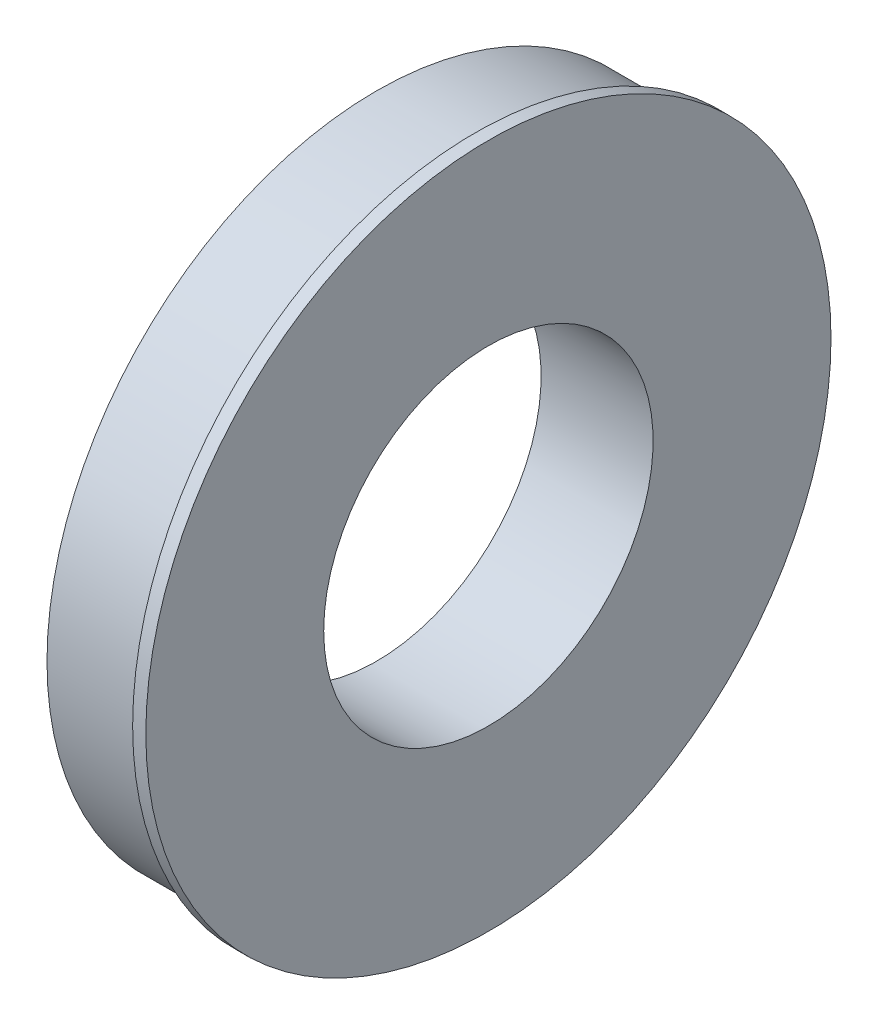
ISO-10303-21;
HEADER;
FILE_DESCRIPTION(('STEP AP214'),'2;1');
FILE_NAME('part.step','',(''),(''),'','','');
FILE_SCHEMA(('AUTOMOTIVE_DESIGN { 1 0 10303 214 1 1 1 1 }'));
ENDSEC;
DATA;
#1=APPLICATION_CONTEXT('core data for automotive mechanical design processes');
#2=APPLICATION_PROTOCOL_DEFINITION('international standard','automotive_design',2000,#1);
#3=PRODUCT_CONTEXT('',#1,'mechanical');
#4=PRODUCT('Part','Part','',(#3));
#5=PRODUCT_RELATED_PRODUCT_CATEGORY('part','',(#4));
#6=PRODUCT_DEFINITION_FORMATION('','',#4);
#7=PRODUCT_DEFINITION_CONTEXT('part definition',#1,'design');
#8=PRODUCT_DEFINITION('design','',#6,#7);
#9=PRODUCT_DEFINITION_SHAPE('','',#8);
#10=(LENGTH_UNIT() NAMED_UNIT(*) SI_UNIT(.MILLI.,.METRE.));
#11=(NAMED_UNIT(*) PLANE_ANGLE_UNIT() SI_UNIT($,.RADIAN.));
#12=(NAMED_UNIT(*) SI_UNIT($,.STERADIAN.) SOLID_ANGLE_UNIT());
#13=UNCERTAINTY_MEASURE_WITH_UNIT(LENGTH_MEASURE(1.E-05),#10,'distance_accuracy_value','');
#14=(GEOMETRIC_REPRESENTATION_CONTEXT(3) GLOBAL_UNCERTAINTY_ASSIGNED_CONTEXT((#13)) GLOBAL_UNIT_ASSIGNED_CONTEXT((#10,
#11,#12)) REPRESENTATION_CONTEXT('',''));
#15=CARTESIAN_POINT('',(0.,0.,0.));
#16=DIRECTION('',(0.,0.,1.));
#17=DIRECTION('',(1.,0.,0.));
#18=AXIS2_PLACEMENT_3D('',#15,#16,#17);
#19=CARTESIAN_POINT('',(0.,0.,0.));
#20=DIRECTION('',(1.,0.,0.));
#21=DIRECTION('',(0.,0.,-1.));
#22=AXIS2_PLACEMENT_3D('',#19,#20,#21);
#23=PLANE('',#22);
#24=CARTESIAN_POINT('',(0.,0.,0.));
#25=DIRECTION('',(1.,0.,0.));
#26=DIRECTION('',(0.,0.,-1.));
#27=AXIS2_PLACEMENT_3D('',#24,#25,#26);
#28=CIRCLE('',#27,63.5);
#29=CARTESIAN_POINT('',(0.,0.,63.5));
#30=VERTEX_POINT('',#29);
#31=EDGE_CURVE('E39',#30,#30,#28,.T.);
#32=ORIENTED_EDGE('',*,*,#31,.F.);
#33=EDGE_LOOP('',(#32));
#34=FACE_BOUND('',#33,.T.);
#35=CARTESIAN_POINT('',(0.,0.,0.));
#36=DIRECTION('',(1.,0.,0.));
#37=DIRECTION('',(0.,0.,-1.));
#38=AXIS2_PLACEMENT_3D('',#35,#36,#37);
#39=CIRCLE('',#38,31.75);
#40=CARTESIAN_POINT('',(0.,0.,31.75));
#41=VERTEX_POINT('',#40);
#42=EDGE_CURVE('E46',#41,#41,#39,.T.);
#43=ORIENTED_EDGE('',*,*,#42,.T.);
#44=EDGE_LOOP('',(#43));
#45=FACE_BOUND('',#44,.T.);
#46=ADVANCED_FACE('F35',(#34,#45),#23,.F.);
#47=CARTESIAN_POINT('',(19.05,0.,0.));
#48=DIRECTION('',(-1.,0.,0.));
#49=DIRECTION('',(0.,0.,1.));
#50=AXIS2_PLACEMENT_3D('',#47,#48,#49);
#51=CYLINDRICAL_SURFACE('',#50,63.5);
#52=CARTESIAN_POINT('',(19.05,0.,0.));
#53=DIRECTION('',(1.,0.,0.));
#54=DIRECTION('',(0.,0.,-1.));
#55=AXIS2_PLACEMENT_3D('',#52,#53,#54);
#56=CIRCLE('',#55,63.5);
#57=CARTESIAN_POINT('',(19.05,0.,63.5));
#58=VERTEX_POINT('',#57);
#59=EDGE_CURVE('E10',#58,#58,#56,.T.);
#60=CARTESIAN_POINT('',(19.05,0.,63.5));
#61=CARTESIAN_POINT('',(18.8515625,0.,63.5));
#62=CARTESIAN_POINT('',(18.653125,0.,63.5));
#63=CARTESIAN_POINT('',(18.25625,0.,63.5));
#64=CARTESIAN_POINT('',(18.0578125,0.,63.5));
#65=CARTESIAN_POINT('',(17.6609375,0.,63.5));
#66=CARTESIAN_POINT('',(17.4625,0.,63.5));
#67=CARTESIAN_POINT('',(17.065625,0.,63.5));
#68=CARTESIAN_POINT('',(16.8671875,0.,63.5));
#69=CARTESIAN_POINT('',(16.4703125,0.,63.5));
#70=CARTESIAN_POINT('',(16.271875,0.,63.5));
#71=CARTESIAN_POINT('',(15.875,0.,63.5));
#72=CARTESIAN_POINT('',(15.6765625,0.,63.5));
#73=CARTESIAN_POINT('',(15.2796875,0.,63.5));
#74=CARTESIAN_POINT('',(15.08125,0.,63.5));
#75=CARTESIAN_POINT('',(14.684375,0.,63.5));
#76=CARTESIAN_POINT('',(14.4859375,0.,63.5));
#77=CARTESIAN_POINT('',(14.0890625,0.,63.5));
#78=CARTESIAN_POINT('',(13.890625,0.,63.5));
#79=CARTESIAN_POINT('',(13.49375,0.,63.5));
#80=CARTESIAN_POINT('',(13.2953125,0.,63.5));
#81=CARTESIAN_POINT('',(12.8984375,0.,63.5));
#82=CARTESIAN_POINT('',(12.7,0.,63.5));
#83=CARTESIAN_POINT('',(12.303125,0.,63.5));
#84=CARTESIAN_POINT('',(12.1046875,0.,63.5));
#85=CARTESIAN_POINT('',(11.7078125,0.,63.5));
#86=CARTESIAN_POINT('',(11.509375,0.,63.5));
#87=CARTESIAN_POINT('',(11.1125,0.,63.5));
#88=CARTESIAN_POINT('',(10.9140625,0.,63.5));
#89=CARTESIAN_POINT('',(10.5171875,0.,63.5));
#90=CARTESIAN_POINT('',(10.31875,0.,63.5));
#91=CARTESIAN_POINT('',(9.921875,0.,63.5));
#92=CARTESIAN_POINT('',(9.7234375,0.,63.5));
#93=CARTESIAN_POINT('',(9.3265625,0.,63.5));
#94=CARTESIAN_POINT('',(9.128125,0.,63.5));
#95=CARTESIAN_POINT('',(8.73125,0.,63.5));
#96=CARTESIAN_POINT('',(8.5328125,0.,63.5));
#97=CARTESIAN_POINT('',(8.1359375,0.,63.5));
#98=CARTESIAN_POINT('',(7.9375,0.,63.5));
#99=CARTESIAN_POINT('',(7.540625,0.,63.5));
#100=CARTESIAN_POINT('',(7.3421875,0.,63.5));
#101=CARTESIAN_POINT('',(6.9453125,0.,63.5));
#102=CARTESIAN_POINT('',(6.746875,0.,63.5));
#103=CARTESIAN_POINT('',(6.35,0.,63.5));
#104=CARTESIAN_POINT('',(6.1515625,0.,63.5));
#105=CARTESIAN_POINT('',(5.7546875,0.,63.5));
#106=CARTESIAN_POINT('',(5.55625,0.,63.5));
#107=CARTESIAN_POINT('',(5.159375,0.,63.5));
#108=CARTESIAN_POINT('',(4.9609375,0.,63.5));
#109=CARTESIAN_POINT('',(4.5640625,0.,63.5));
#110=CARTESIAN_POINT('',(4.365625,0.,63.5));
#111=CARTESIAN_POINT('',(3.96875,0.,63.5));
#112=CARTESIAN_POINT('',(3.7703125,0.,63.5));
#113=CARTESIAN_POINT('',(3.3734375,0.,63.5));
#114=CARTESIAN_POINT('',(3.175,0.,63.5));
#115=CARTESIAN_POINT('',(2.778125,0.,63.5));
#116=CARTESIAN_POINT('',(2.5796875,0.,63.5));
#117=CARTESIAN_POINT('',(2.1828125,0.,63.5));
#118=CARTESIAN_POINT('',(1.984375,0.,63.5));
#119=CARTESIAN_POINT('',(1.5875,0.,63.5));
#120=CARTESIAN_POINT('',(1.3890625,0.,63.5));
#121=CARTESIAN_POINT('',(0.992187500000001,0.,63.5));
#122=CARTESIAN_POINT('',(0.793750000000001,0.,63.5));
#123=CARTESIAN_POINT('',(0.396875,0.,63.5));
#124=CARTESIAN_POINT('',(0.1984375,0.,63.5));
#125=CARTESIAN_POINT('',(0.,0.,63.5));
#126=B_SPLINE_CURVE_WITH_KNOTS('',3,(#60,#61,#62,#63,#64,#65,#66,#67,#68,#69,#70,#71,#72,#73,
#74,#75,#76,#77,#78,#79,#80,#81,#82,#83,#84,#85,#86,#87,#88,#89,#90,#91,#92,#93,#94,#95,#96,#97,
#98,#99,#100,#101,#102,#103,#104,#105,#106,#107,#108,#109,#110,#111,#112,#113,#114,#115,#116,
#117,#118,#119,#120,#121,#122,#123,#124,#125),.UNSPECIFIED.,.F.,.F.,(4,2,2,2,2,2,2,2,2,2,2,2,2,
2,2,2,2,2,2,2,2,2,2,2,2,2,2,2,2,2,2,2,4),(0.,0.5953125,1.190625,1.7859375,2.38125,2.9765625,
3.571875,4.1671875,4.7625,5.3578125,5.953125,6.5484375,7.14375,7.7390625,8.334375,8.9296875,
9.525,10.1203125,10.715625,11.3109375,11.90625,12.5015625,13.096875,13.6921875,14.2875,
14.8828125,15.478125,16.0734375,16.66875,17.2640625,17.859375,18.4546875,19.05),.UNSPECIFIED.);
#127=EDGE_CURVE('BSEAM37',#58,#30,#126,.T.);
#128=ORIENTED_EDGE('',*,*,#59,.F.);
#129=ORIENTED_EDGE('',*,*,#31,.T.);
#130=ORIENTED_EDGE('',*,*,#127,.T.);
#131=ORIENTED_EDGE('',*,*,#127,.F.);
#132=EDGE_LOOP('',(#128,#130,#129,#131));
#133=FACE_BOUND('',#132,.T.);
#134=ADVANCED_FACE('F37',(#133),#51,.T.);
#135=CARTESIAN_POINT('',(19.05,0.,0.));
#136=DIRECTION('',(-1.,0.,0.));
#137=DIRECTION('',(0.,0.,1.));
#138=AXIS2_PLACEMENT_3D('',#135,#136,#137);
#139=CYLINDRICAL_SURFACE('',#138,31.75);
#140=CARTESIAN_POINT('',(21.59,0.,0.));
#141=DIRECTION('',(1.,0.,0.));
#142=DIRECTION('',(0.,0.,-1.));
#143=AXIS2_PLACEMENT_3D('',#140,#141,#142);
#144=CIRCLE('',#143,31.75);
#145=CARTESIAN_POINT('',(21.59,0.,31.75));
#146=VERTEX_POINT('',#145);
#147=EDGE_CURVE('E54',#146,#146,#144,.T.);
#148=CARTESIAN_POINT('',(0.,0.,31.75));
#149=CARTESIAN_POINT('',(0.224895833333333,0.,31.75));
#150=CARTESIAN_POINT('',(0.449791666666667,0.,31.75));
#151=CARTESIAN_POINT('',(0.899583333333333,0.,31.75));
#152=CARTESIAN_POINT('',(1.12447916666667,0.,31.75));
#153=CARTESIAN_POINT('',(1.57427083333333,0.,31.75));
#154=CARTESIAN_POINT('',(1.79916666666667,0.,31.75));
#155=CARTESIAN_POINT('',(2.24895833333333,0.,31.75));
#156=CARTESIAN_POINT('',(2.47385416666667,0.,31.75));
#157=CARTESIAN_POINT('',(2.92364583333333,0.,31.75));
#158=CARTESIAN_POINT('',(3.14854166666667,0.,31.75));
#159=CARTESIAN_POINT('',(3.59833333333333,0.,31.75));
#160=CARTESIAN_POINT('',(3.82322916666667,0.,31.75));
#161=CARTESIAN_POINT('',(4.27302083333333,0.,31.75));
#162=CARTESIAN_POINT('',(4.49791666666667,0.,31.75));
#163=CARTESIAN_POINT('',(4.94770833333333,0.,31.75));
#164=CARTESIAN_POINT('',(5.17260416666667,0.,31.75));
#165=CARTESIAN_POINT('',(5.62239583333333,0.,31.75));
#166=CARTESIAN_POINT('',(5.84729166666667,0.,31.75));
#167=CARTESIAN_POINT('',(6.29708333333333,0.,31.75));
#168=CARTESIAN_POINT('',(6.52197916666667,0.,31.75));
#169=CARTESIAN_POINT('',(6.97177083333333,0.,31.75));
#170=CARTESIAN_POINT('',(7.19666666666667,0.,31.75));
#171=CARTESIAN_POINT('',(7.64645833333333,0.,31.75));
#172=CARTESIAN_POINT('',(7.87135416666667,0.,31.75));
#173=CARTESIAN_POINT('',(8.32114583333333,0.,31.75));
#174=CARTESIAN_POINT('',(8.54604166666667,0.,31.75));
#175=CARTESIAN_POINT('',(8.99583333333334,0.,31.75));
#176=CARTESIAN_POINT('',(9.22072916666667,0.,31.75));
#177=CARTESIAN_POINT('',(9.67052083333333,0.,31.75));
#178=CARTESIAN_POINT('',(9.89541666666667,0.,31.75));
#179=CARTESIAN_POINT('',(10.3452083333333,0.,31.75));
#180=CARTESIAN_POINT('',(10.5701041666667,0.,31.75));
#181=CARTESIAN_POINT('',(11.0198958333333,0.,31.75));
#182=CARTESIAN_POINT('',(11.2447916666667,0.,31.75));
#183=CARTESIAN_POINT('',(11.6945833333333,0.,31.75));
#184=CARTESIAN_POINT('',(11.9194791666667,0.,31.75));
#185=CARTESIAN_POINT('',(12.3692708333333,0.,31.75));
#186=CARTESIAN_POINT('',(12.5941666666667,0.,31.75));
#187=CARTESIAN_POINT('',(13.0439583333333,0.,31.75));
#188=CARTESIAN_POINT('',(13.2688541666667,0.,31.75));
#189=CARTESIAN_POINT('',(13.7186458333333,0.,31.75));
#190=CARTESIAN_POINT('',(13.9435416666667,0.,31.75));
#191=CARTESIAN_POINT('',(14.3933333333333,0.,31.75));
#192=CARTESIAN_POINT('',(14.6182291666667,0.,31.75));
#193=CARTESIAN_POINT('',(15.0680208333333,0.,31.75));
#194=CARTESIAN_POINT('',(15.2929166666667,0.,31.75));
#195=CARTESIAN_POINT('',(15.7427083333333,0.,31.75));
#196=CARTESIAN_POINT('',(15.9676041666667,0.,31.75));
#197=CARTESIAN_POINT('',(16.4173958333333,0.,31.75));
#198=CARTESIAN_POINT('',(16.6422916666667,0.,31.75));
#199=CARTESIAN_POINT('',(17.0920833333333,0.,31.75));
#200=CARTESIAN_POINT('',(17.3169791666667,0.,31.75));
#201=CARTESIAN_POINT('',(17.7667708333333,0.,31.75));
#202=CARTESIAN_POINT('',(17.9916666666667,0.,31.75));
#203=CARTESIAN_POINT('',(18.4414583333333,0.,31.75));
#204=CARTESIAN_POINT('',(18.6663541666667,0.,31.75));
#205=CARTESIAN_POINT('',(19.1161458333333,0.,31.75));
#206=CARTESIAN_POINT('',(19.3410416666667,0.,31.75));
#207=CARTESIAN_POINT('',(19.7908333333333,0.,31.75));
#208=CARTESIAN_POINT('',(20.0157291666667,0.,31.75));
#209=CARTESIAN_POINT('',(20.4655208333333,0.,31.75));
#210=CARTESIAN_POINT('',(20.6904166666667,0.,31.75));
#211=CARTESIAN_POINT('',(21.1402083333333,0.,31.75));
#212=CARTESIAN_POINT('',(21.3651041666667,0.,31.75));
#213=CARTESIAN_POINT('',(21.59,0.,31.75));
#214=B_SPLINE_CURVE_WITH_KNOTS('',3,(#148,#149,#150,#151,#152,#153,#154,#155,#156,#157,#158,
#159,#160,#161,#162,#163,#164,#165,#166,#167,#168,#169,#170,#171,#172,#173,#174,#175,#176,#177,
#178,#179,#180,#181,#182,#183,#184,#185,#186,#187,#188,#189,#190,#191,#192,#193,#194,#195,#196,
#197,#198,#199,#200,#201,#202,#203,#204,#205,#206,#207,#208,#209,#210,#211,#212,#213),
.UNSPECIFIED.,.F.,.F.,(4,2,2,2,2,2,2,2,2,2,2,2,2,2,2,2,2,2,2,2,2,2,2,2,2,2,2,2,2,2,2,2,4),(0.,
0.6746875,1.349375,2.0240625,2.69875,3.3734375,4.048125,4.7228125,5.3975,6.0721875,6.746875,
7.4215625,8.09625,8.7709375,9.445625,10.1203125,10.795,11.4696875,12.144375,12.8190625,13.49375,
14.1684375,14.843125,15.5178125,16.1925,16.8671875,17.541875,18.2165625,18.89125,19.5659375,
20.240625,20.9153125,21.59),.UNSPECIFIED.);
#215=EDGE_CURVE('BSEAM60',#41,#146,#214,.T.);
#216=ORIENTED_EDGE('',*,*,#42,.F.);
#217=ORIENTED_EDGE('',*,*,#147,.T.);
#218=ORIENTED_EDGE('',*,*,#215,.T.);
#219=ORIENTED_EDGE('',*,*,#215,.F.);
#220=EDGE_LOOP('',(#216,#218,#217,#219));
#221=FACE_BOUND('',#220,.T.);
#222=ADVANCED_FACE('F60',(#221),#139,.F.);
#223=CARTESIAN_POINT('',(21.59,0.,0.));
#224=DIRECTION('',(1.,0.,0.));
#225=DIRECTION('',(0.,0.,-1.));
#226=AXIS2_PLACEMENT_3D('',#223,#224,#225);
#227=PLANE('',#226);
#228=CARTESIAN_POINT('',(21.59,0.,0.));
#229=DIRECTION('',(1.,0.,0.));
#230=DIRECTION('',(0.,0.,-1.));
#231=AXIS2_PLACEMENT_3D('',#228,#229,#230);
#232=CIRCLE('',#231,66.04);
#233=CARTESIAN_POINT('',(21.59,0.,-66.04));
#234=VERTEX_POINT('',#233);
#235=EDGE_CURVE('E50',#234,#234,#232,.T.);
#236=ORIENTED_EDGE('',*,*,#235,.T.);
#237=EDGE_LOOP('',(#236));
#238=FACE_BOUND('',#237,.T.);
#239=ORIENTED_EDGE('',*,*,#147,.F.);
#240=EDGE_LOOP('',(#239));
#241=FACE_BOUND('',#240,.T.);
#242=ADVANCED_FACE('F62',(#238,#241),#227,.T.);
#243=CARTESIAN_POINT('',(19.05,0.,0.));
#244=DIRECTION('',(1.,0.,0.));
#245=DIRECTION('',(0.,0.,-1.));
#246=AXIS2_PLACEMENT_3D('',#243,#244,#245);
#247=PLANE('',#246);
#248=ORIENTED_EDGE('',*,*,#59,.T.);
#249=EDGE_LOOP('',(#248));
#250=FACE_BOUND('',#249,.T.);
#251=CARTESIAN_POINT('',(19.05,0.,0.));
#252=DIRECTION('',(1.,0.,0.));
#253=DIRECTION('',(0.,0.,-1.));
#254=AXIS2_PLACEMENT_3D('',#251,#252,#253);
#255=CIRCLE('',#254,66.04);
#256=CARTESIAN_POINT('',(19.05,0.,-66.04));
#257=VERTEX_POINT('',#256);
#258=EDGE_CURVE('E51',#257,#257,#255,.T.);
#259=ORIENTED_EDGE('',*,*,#258,.F.);
#260=EDGE_LOOP('',(#259));
#261=FACE_BOUND('',#260,.T.);
#262=ADVANCED_FACE('F64',(#250,#261),#247,.F.);
#263=CARTESIAN_POINT('',(21.59,0.,0.));
#264=DIRECTION('',(-1.,0.,0.));
#265=DIRECTION('',(0.,0.,1.));
#266=AXIS2_PLACEMENT_3D('',#263,#264,#265);
#267=CYLINDRICAL_SURFACE('',#266,66.04);
#268=ORIENTED_EDGE('',*,*,#235,.F.);
#269=EDGE_LOOP('',(#268));
#270=FACE_BOUND('',#269,.T.);
#271=ORIENTED_EDGE('',*,*,#258,.T.);
#272=EDGE_LOOP('',(#271));
#273=FACE_BOUND('',#272,.T.);
#274=ADVANCED_FACE('F71',(#270,#273),#267,.T.);
#275=CLOSED_SHELL('',(#46,#134,#222,#242,#262,#274));
#276=MANIFOLD_SOLID_BREP('B2',#275);
#277=ADVANCED_BREP_SHAPE_REPRESENTATION('',(#18,#276),#14);
#278=SHAPE_DEFINITION_REPRESENTATION(#9,#277);
ENDSEC;
END-ISO-10303-21;
